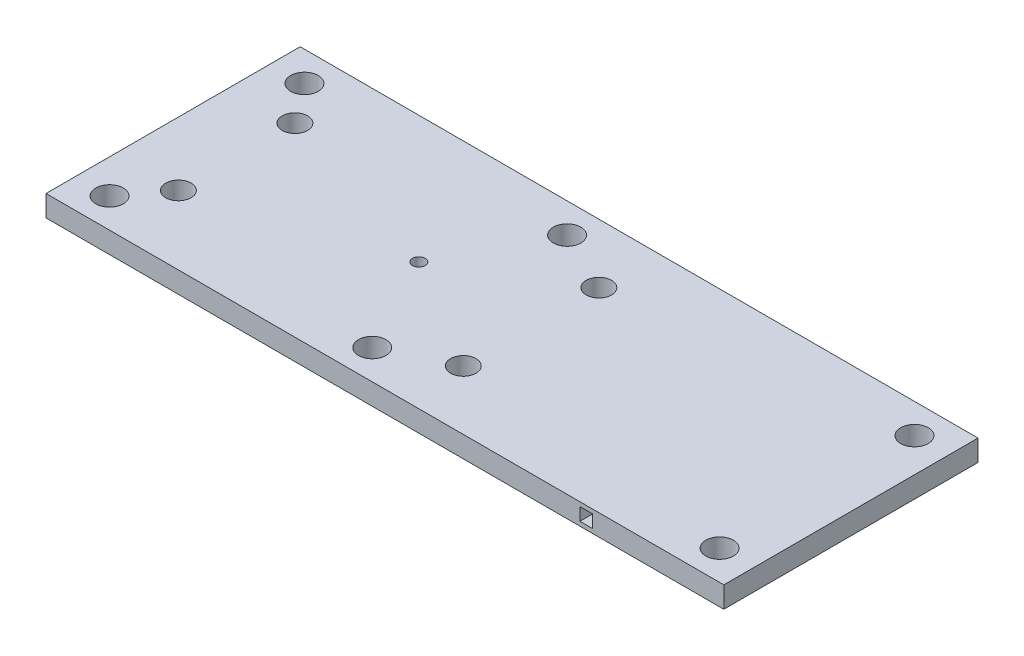
ISO-10303-21;
HEADER;
FILE_DESCRIPTION(('STEP AP214'),'2;1');
FILE_NAME('part.step','',(''),(''),'','','');
FILE_SCHEMA(('AUTOMOTIVE_DESIGN { 1 0 10303 214 1 1 1 1 }'));
ENDSEC;
DATA;
#1=APPLICATION_CONTEXT('core data for automotive mechanical design processes');
#2=APPLICATION_PROTOCOL_DEFINITION('international standard','automotive_design',2000,#1);
#3=PRODUCT_CONTEXT('',#1,'mechanical');
#4=PRODUCT('Part','Part','',(#3));
#5=PRODUCT_RELATED_PRODUCT_CATEGORY('part','',(#4));
#6=PRODUCT_DEFINITION_FORMATION('','',#4);
#7=PRODUCT_DEFINITION_CONTEXT('part definition',#1,'design');
#8=PRODUCT_DEFINITION('design','',#6,#7);
#9=PRODUCT_DEFINITION_SHAPE('','',#8);
#10=(LENGTH_UNIT() NAMED_UNIT(*) SI_UNIT(.MILLI.,.METRE.));
#11=(NAMED_UNIT(*) PLANE_ANGLE_UNIT() SI_UNIT($,.RADIAN.));
#12=(NAMED_UNIT(*) SI_UNIT($,.STERADIAN.) SOLID_ANGLE_UNIT());
#13=UNCERTAINTY_MEASURE_WITH_UNIT(LENGTH_MEASURE(1.E-05),#10,'distance_accuracy_value','');
#14=(GEOMETRIC_REPRESENTATION_CONTEXT(3) GLOBAL_UNCERTAINTY_ASSIGNED_CONTEXT((#13)) GLOBAL_UNIT_ASSIGNED_CONTEXT((#10,
#11,#12)) REPRESENTATION_CONTEXT('',''));
#15=CARTESIAN_POINT('',(0.,0.,0.));
#16=DIRECTION('',(0.,0.,1.));
#17=DIRECTION('',(1.,0.,0.));
#18=AXIS2_PLACEMENT_3D('',#15,#16,#17);
#19=CARTESIAN_POINT('',(0.,5.,0.));
#20=DIRECTION('',(0.,-1.,0.));
#21=DIRECTION('',(0.,0.,-1.));
#22=AXIS2_PLACEMENT_3D('',#19,#20,#21);
#23=PLANE('',#22);
#24=DIRECTION('',(0.,0.,-1.));
#25=VECTOR('',#24,1.);
#26=CARTESIAN_POINT('',(80.,5.,30.));
#27=LINE('',#26,#25);
#28=CARTESIAN_POINT('',(80.,5.,30.));
#29=VERTEX_POINT('',#28);
#30=CARTESIAN_POINT('',(80.,5.,-30.));
#31=VERTEX_POINT('',#30);
#32=EDGE_CURVE('E213',#29,#31,#27,.T.);
#33=ORIENTED_EDGE('',*,*,#32,.T.);
#34=DIRECTION('',(-1.,0.,0.));
#35=VECTOR('',#34,1.);
#36=CARTESIAN_POINT('',(-80.,5.,-30.));
#37=LINE('',#36,#35);
#38=CARTESIAN_POINT('',(-80.,5.,-30.));
#39=VERTEX_POINT('',#38);
#40=EDGE_CURVE('E216',#31,#39,#37,.T.);
#41=ORIENTED_EDGE('',*,*,#40,.T.);
#42=DIRECTION('',(0.,0.,1.));
#43=VECTOR('',#42,1.);
#44=CARTESIAN_POINT('',(-80.,5.,30.));
#45=LINE('',#44,#43);
#46=CARTESIAN_POINT('',(-80.,5.,30.));
#47=VERTEX_POINT('',#46);
#48=EDGE_CURVE('E219',#39,#47,#45,.T.);
#49=ORIENTED_EDGE('',*,*,#48,.T.);
#50=DIRECTION('',(1.,0.,0.));
#51=VECTOR('',#50,1.);
#52=CARTESIAN_POINT('',(-80.,5.,30.));
#53=LINE('',#52,#51);
#54=EDGE_CURVE('E221',#47,#29,#53,.T.);
#55=ORIENTED_EDGE('',*,*,#54,.T.);
#56=EDGE_LOOP('',(#33,#41,#49,#55));
#57=FACE_BOUND('',#56,.T.);
#58=CARTESIAN_POINT('',(-72.,5.,-23.));
#59=DIRECTION('',(0.,1.,0.));
#60=DIRECTION('',(0.,0.,1.));
#61=AXIS2_PLACEMENT_3D('',#58,#59,#60);
#62=CIRCLE('',#61,3.25000000000001);
#63=CARTESIAN_POINT('',(-72.,5.,-19.75));
#64=VERTEX_POINT('',#63);
#65=EDGE_CURVE('E207',#64,#64,#62,.T.);
#66=ORIENTED_EDGE('',*,*,#65,.F.);
#67=EDGE_LOOP('',(#66));
#68=FACE_BOUND('',#67,.T.);
#69=CARTESIAN_POINT('',(-72.,5.,23.));
#70=DIRECTION('',(0.,1.,0.));
#71=DIRECTION('',(0.,0.,1.));
#72=AXIS2_PLACEMENT_3D('',#69,#70,#71);
#73=CIRCLE('',#72,3.25000000000001);
#74=CARTESIAN_POINT('',(-72.,5.,26.25));
#75=VERTEX_POINT('',#74);
#76=EDGE_CURVE('E201',#75,#75,#73,.T.);
#77=ORIENTED_EDGE('',*,*,#76,.F.);
#78=EDGE_LOOP('',(#77));
#79=FACE_BOUND('',#78,.T.);
#80=CARTESIAN_POINT('',(72.,5.,-23.));
#81=DIRECTION('',(0.,1.,0.));
#82=DIRECTION('',(0.,0.,1.));
#83=AXIS2_PLACEMENT_3D('',#80,#81,#82);
#84=CIRCLE('',#83,3.25000000000001);
#85=CARTESIAN_POINT('',(72.,5.,-19.75));
#86=VERTEX_POINT('',#85);
#87=EDGE_CURVE('E195',#86,#86,#84,.T.);
#88=ORIENTED_EDGE('',*,*,#87,.F.);
#89=EDGE_LOOP('',(#88));
#90=FACE_BOUND('',#89,.T.);
#91=CARTESIAN_POINT('',(72.,5.,23.));
#92=DIRECTION('',(0.,1.,0.));
#93=DIRECTION('',(0.,0.,1.));
#94=AXIS2_PLACEMENT_3D('',#91,#92,#93);
#95=CIRCLE('',#94,3.25000000000001);
#96=CARTESIAN_POINT('',(72.,5.,26.25));
#97=VERTEX_POINT('',#96);
#98=EDGE_CURVE('E189',#97,#97,#95,.T.);
#99=ORIENTED_EDGE('',*,*,#98,.F.);
#100=EDGE_LOOP('',(#99));
#101=FACE_BOUND('',#100,.T.);
#102=CARTESIAN_POINT('',(-9.99999999999999,5.,-23.));
#103=DIRECTION('',(0.,1.,0.));
#104=DIRECTION('',(0.,0.,1.));
#105=AXIS2_PLACEMENT_3D('',#102,#103,#104);
#106=CIRCLE('',#105,3.25);
#107=CARTESIAN_POINT('',(-9.99999999999999,5.,-19.75));
#108=VERTEX_POINT('',#107);
#109=EDGE_CURVE('E183',#108,#108,#106,.T.);
#110=ORIENTED_EDGE('',*,*,#109,.F.);
#111=EDGE_LOOP('',(#110));
#112=FACE_BOUND('',#111,.T.);
#113=CARTESIAN_POINT('',(-9.99999999999999,5.,23.));
#114=DIRECTION('',(0.,1.,0.));
#115=DIRECTION('',(0.,0.,1.));
#116=AXIS2_PLACEMENT_3D('',#113,#114,#115);
#117=CIRCLE('',#116,3.25);
#118=CARTESIAN_POINT('',(-9.99999999999999,5.,26.25));
#119=VERTEX_POINT('',#118);
#120=EDGE_CURVE('E177',#119,#119,#117,.T.);
#121=ORIENTED_EDGE('',*,*,#120,.F.);
#122=EDGE_LOOP('',(#121));
#123=FACE_BOUND('',#122,.T.);
#124=CARTESIAN_POINT('',(4.5,5.,-16.));
#125=DIRECTION('',(0.,1.,0.));
#126=DIRECTION('',(0.,0.,1.));
#127=AXIS2_PLACEMENT_3D('',#124,#125,#126);
#128=CIRCLE('',#127,3.);
#129=CARTESIAN_POINT('',(4.5,5.,-13.));
#130=VERTEX_POINT('',#129);
#131=EDGE_CURVE('E171',#130,#130,#128,.T.);
#132=ORIENTED_EDGE('',*,*,#131,.F.);
#133=EDGE_LOOP('',(#132));
#134=FACE_BOUND('',#133,.T.);
#135=CARTESIAN_POINT('',(4.5,5.,16.));
#136=DIRECTION('',(0.,1.,0.));
#137=DIRECTION('',(0.,0.,1.));
#138=AXIS2_PLACEMENT_3D('',#135,#136,#137);
#139=CIRCLE('',#138,3.);
#140=CARTESIAN_POINT('',(4.5,5.,19.));
#141=VERTEX_POINT('',#140);
#142=EDGE_CURVE('E165',#141,#141,#139,.T.);
#143=ORIENTED_EDGE('',*,*,#142,.F.);
#144=EDGE_LOOP('',(#143));
#145=FACE_BOUND('',#144,.T.);
#146=CARTESIAN_POINT('',(-65.,5.,-13.75));
#147=DIRECTION('',(0.,1.,0.));
#148=DIRECTION('',(0.,0.,1.));
#149=AXIS2_PLACEMENT_3D('',#146,#147,#148);
#150=CIRCLE('',#149,3.);
#151=CARTESIAN_POINT('',(-65.,5.,-10.75));
#152=VERTEX_POINT('',#151);
#153=EDGE_CURVE('E159',#152,#152,#150,.T.);
#154=ORIENTED_EDGE('',*,*,#153,.F.);
#155=EDGE_LOOP('',(#154));
#156=FACE_BOUND('',#155,.T.);
#157=CARTESIAN_POINT('',(-65.,5.,13.75));
#158=DIRECTION('',(0.,1.,0.));
#159=DIRECTION('',(0.,0.,1.));
#160=AXIS2_PLACEMENT_3D('',#157,#158,#159);
#161=CIRCLE('',#160,3.);
#162=CARTESIAN_POINT('',(-65.,5.,16.75));
#163=VERTEX_POINT('',#162);
#164=EDGE_CURVE('E153',#163,#163,#161,.T.);
#165=ORIENTED_EDGE('',*,*,#164,.F.);
#166=EDGE_LOOP('',(#165));
#167=FACE_BOUND('',#166,.T.);
#168=CARTESIAN_POINT('',(-22.,5.,0.));
#169=DIRECTION('',(0.,1.,0.));
#170=DIRECTION('',(0.,0.,1.));
#171=AXIS2_PLACEMENT_3D('',#168,#169,#170);
#172=CIRCLE('',#171,1.5);
#173=CARTESIAN_POINT('',(-22.,5.,1.5));
#174=VERTEX_POINT('',#173);
#175=EDGE_CURVE('E147',#174,#174,#172,.T.);
#176=ORIENTED_EDGE('',*,*,#175,.F.);
#177=EDGE_LOOP('',(#176));
#178=FACE_BOUND('',#177,.T.);
#179=ADVANCED_FACE('F44',(#57,#68,#79,#90,#101,#112,#123,#134,#145,#156,#167,#178),#23,.F.);
#180=CARTESIAN_POINT('',(0.,0.,0.));
#181=DIRECTION('',(0.,-1.,0.));
#182=DIRECTION('',(0.,0.,-1.));
#183=AXIS2_PLACEMENT_3D('',#180,#181,#182);
#184=PLANE('',#183);
#185=CARTESIAN_POINT('',(-65.,0.,13.75));
#186=DIRECTION('',(0.,1.,0.));
#187=DIRECTION('',(0.,0.,1.));
#188=AXIS2_PLACEMENT_3D('',#185,#186,#187);
#189=CIRCLE('',#188,3.);
#190=CARTESIAN_POINT('',(-65.,0.,16.75));
#191=VERTEX_POINT('',#190);
#192=EDGE_CURVE('E150',#191,#191,#189,.T.);
#193=ORIENTED_EDGE('',*,*,#192,.T.);
#194=EDGE_LOOP('',(#193));
#195=FACE_BOUND('',#194,.T.);
#196=CARTESIAN_POINT('',(4.5,0.,16.));
#197=DIRECTION('',(0.,1.,0.));
#198=DIRECTION('',(0.,0.,1.));
#199=AXIS2_PLACEMENT_3D('',#196,#197,#198);
#200=CIRCLE('',#199,3.);
#201=CARTESIAN_POINT('',(4.5,0.,19.));
#202=VERTEX_POINT('',#201);
#203=EDGE_CURVE('E162',#202,#202,#200,.T.);
#204=ORIENTED_EDGE('',*,*,#203,.T.);
#205=EDGE_LOOP('',(#204));
#206=FACE_BOUND('',#205,.T.);
#207=CARTESIAN_POINT('',(-9.99999999999999,0.,23.));
#208=DIRECTION('',(0.,1.,0.));
#209=DIRECTION('',(0.,0.,1.));
#210=AXIS2_PLACEMENT_3D('',#207,#208,#209);
#211=CIRCLE('',#210,3.25);
#212=CARTESIAN_POINT('',(-9.99999999999999,0.,26.25));
#213=VERTEX_POINT('',#212);
#214=EDGE_CURVE('E174',#213,#213,#211,.T.);
#215=ORIENTED_EDGE('',*,*,#214,.T.);
#216=EDGE_LOOP('',(#215));
#217=FACE_BOUND('',#216,.T.);
#218=CARTESIAN_POINT('',(72.,0.,23.));
#219=DIRECTION('',(0.,1.,0.));
#220=DIRECTION('',(0.,0.,1.));
#221=AXIS2_PLACEMENT_3D('',#218,#219,#220);
#222=CIRCLE('',#221,3.25000000000001);
#223=CARTESIAN_POINT('',(72.,0.,26.25));
#224=VERTEX_POINT('',#223);
#225=EDGE_CURVE('E186',#224,#224,#222,.T.);
#226=ORIENTED_EDGE('',*,*,#225,.T.);
#227=EDGE_LOOP('',(#226));
#228=FACE_BOUND('',#227,.T.);
#229=CARTESIAN_POINT('',(-72.,0.,23.));
#230=DIRECTION('',(0.,1.,0.));
#231=DIRECTION('',(0.,0.,1.));
#232=AXIS2_PLACEMENT_3D('',#229,#230,#231);
#233=CIRCLE('',#232,3.25000000000001);
#234=CARTESIAN_POINT('',(-72.,0.,26.25));
#235=VERTEX_POINT('',#234);
#236=EDGE_CURVE('E198',#235,#235,#233,.T.);
#237=ORIENTED_EDGE('',*,*,#236,.T.);
#238=EDGE_LOOP('',(#237));
#239=FACE_BOUND('',#238,.T.);
#240=DIRECTION('',(0.,0.,-1.));
#241=VECTOR('',#240,1.);
#242=CARTESIAN_POINT('',(80.,0.,30.));
#243=LINE('',#242,#241);
#244=CARTESIAN_POINT('',(80.,0.,30.));
#245=VERTEX_POINT('',#244);
#246=CARTESIAN_POINT('',(80.,0.,-30.));
#247=VERTEX_POINT('',#246);
#248=EDGE_CURVE('E210',#245,#247,#243,.T.);
#249=ORIENTED_EDGE('',*,*,#248,.F.);
#250=DIRECTION('',(1.,0.,0.));
#251=VECTOR('',#250,1.);
#252=CARTESIAN_POINT('',(-80.,0.,30.));
#253=LINE('',#252,#251);
#254=CARTESIAN_POINT('',(-80.,0.,30.));
#255=VERTEX_POINT('',#254);
#256=EDGE_CURVE('E217',#255,#245,#253,.T.);
#257=ORIENTED_EDGE('',*,*,#256,.F.);
#258=DIRECTION('',(0.,0.,1.));
#259=VECTOR('',#258,1.);
#260=CARTESIAN_POINT('',(-80.,0.,30.));
#261=LINE('',#260,#259);
#262=CARTESIAN_POINT('',(-80.,0.,-30.));
#263=VERTEX_POINT('',#262);
#264=EDGE_CURVE('E228',#263,#255,#261,.T.);
#265=ORIENTED_EDGE('',*,*,#264,.F.);
#266=DIRECTION('',(-1.,0.,0.));
#267=VECTOR('',#266,1.);
#268=CARTESIAN_POINT('',(-80.,0.,-30.));
#269=LINE('',#268,#267);
#270=EDGE_CURVE('E226',#247,#263,#269,.T.);
#271=ORIENTED_EDGE('',*,*,#270,.F.);
#272=EDGE_LOOP('',(#249,#257,#265,#271));
#273=FACE_BOUND('',#272,.T.);
#274=CARTESIAN_POINT('',(-72.,0.,-23.));
#275=DIRECTION('',(0.,1.,0.));
#276=DIRECTION('',(0.,0.,1.));
#277=AXIS2_PLACEMENT_3D('',#274,#275,#276);
#278=CIRCLE('',#277,3.25000000000001);
#279=CARTESIAN_POINT('',(-72.,0.,-19.75));
#280=VERTEX_POINT('',#279);
#281=EDGE_CURVE('E204',#280,#280,#278,.T.);
#282=ORIENTED_EDGE('',*,*,#281,.T.);
#283=EDGE_LOOP('',(#282));
#284=FACE_BOUND('',#283,.T.);
#285=CARTESIAN_POINT('',(72.,0.,-23.));
#286=DIRECTION('',(0.,1.,0.));
#287=DIRECTION('',(0.,0.,1.));
#288=AXIS2_PLACEMENT_3D('',#285,#286,#287);
#289=CIRCLE('',#288,3.25000000000001);
#290=CARTESIAN_POINT('',(72.,0.,-19.75));
#291=VERTEX_POINT('',#290);
#292=EDGE_CURVE('E192',#291,#291,#289,.T.);
#293=ORIENTED_EDGE('',*,*,#292,.T.);
#294=EDGE_LOOP('',(#293));
#295=FACE_BOUND('',#294,.T.);
#296=CARTESIAN_POINT('',(-9.99999999999999,0.,-23.));
#297=DIRECTION('',(0.,1.,0.));
#298=DIRECTION('',(0.,0.,1.));
#299=AXIS2_PLACEMENT_3D('',#296,#297,#298);
#300=CIRCLE('',#299,3.25);
#301=CARTESIAN_POINT('',(-9.99999999999999,0.,-19.75));
#302=VERTEX_POINT('',#301);
#303=EDGE_CURVE('E180',#302,#302,#300,.T.);
#304=ORIENTED_EDGE('',*,*,#303,.T.);
#305=EDGE_LOOP('',(#304));
#306=FACE_BOUND('',#305,.T.);
#307=CARTESIAN_POINT('',(4.5,0.,-16.));
#308=DIRECTION('',(0.,1.,0.));
#309=DIRECTION('',(0.,0.,1.));
#310=AXIS2_PLACEMENT_3D('',#307,#308,#309);
#311=CIRCLE('',#310,3.);
#312=CARTESIAN_POINT('',(4.5,0.,-13.));
#313=VERTEX_POINT('',#312);
#314=EDGE_CURVE('E168',#313,#313,#311,.T.);
#315=ORIENTED_EDGE('',*,*,#314,.T.);
#316=EDGE_LOOP('',(#315));
#317=FACE_BOUND('',#316,.T.);
#318=CARTESIAN_POINT('',(-65.,0.,-13.75));
#319=DIRECTION('',(0.,1.,0.));
#320=DIRECTION('',(0.,0.,1.));
#321=AXIS2_PLACEMENT_3D('',#318,#319,#320);
#322=CIRCLE('',#321,3.);
#323=CARTESIAN_POINT('',(-65.,0.,-10.75));
#324=VERTEX_POINT('',#323);
#325=EDGE_CURVE('E156',#324,#324,#322,.T.);
#326=ORIENTED_EDGE('',*,*,#325,.T.);
#327=EDGE_LOOP('',(#326));
#328=FACE_BOUND('',#327,.T.);
#329=CARTESIAN_POINT('',(-22.,0.,0.));
#330=DIRECTION('',(0.,1.,0.));
#331=DIRECTION('',(0.,0.,1.));
#332=AXIS2_PLACEMENT_3D('',#329,#330,#331);
#333=CIRCLE('',#332,1.5);
#334=CARTESIAN_POINT('',(-22.,0.,1.5));
#335=VERTEX_POINT('',#334);
#336=EDGE_CURVE('E146',#335,#335,#333,.T.);
#337=ORIENTED_EDGE('',*,*,#336,.T.);
#338=EDGE_LOOP('',(#337));
#339=FACE_BOUND('',#338,.T.);
#340=ADVANCED_FACE('F246',(#195,#206,#217,#228,#239,#273,#284,#295,#306,#317,#328,#339),#184,.T.);
#341=CARTESIAN_POINT('',(80.,5.,30.));
#342=DIRECTION('',(-1.,0.,0.));
#343=DIRECTION('',(0.,0.,1.));
#344=AXIS2_PLACEMENT_3D('',#341,#342,#343);
#345=PLANE('',#344);
#346=ORIENTED_EDGE('',*,*,#248,.T.);
#347=DIRECTION('',(0.,-1.,0.));
#348=VECTOR('',#347,1.);
#349=CARTESIAN_POINT('',(80.,5.,-30.));
#350=LINE('',#349,#348);
#351=EDGE_CURVE('E11',#31,#247,#350,.T.);
#352=ORIENTED_EDGE('',*,*,#351,.F.);
#353=ORIENTED_EDGE('',*,*,#32,.F.);
#354=DIRECTION('',(0.,-1.,0.));
#355=VECTOR('',#354,1.);
#356=CARTESIAN_POINT('',(80.,5.,30.));
#357=LINE('',#356,#355);
#358=EDGE_CURVE('E223',#29,#245,#357,.T.);
#359=ORIENTED_EDGE('',*,*,#358,.T.);
#360=EDGE_LOOP('',(#346,#352,#353,#359));
#361=FACE_BOUND('',#360,.T.);
#362=ADVANCED_FACE('F46',(#361),#345,.F.);
#363=CARTESIAN_POINT('',(-80.,5.,-30.));
#364=DIRECTION('',(0.,0.,1.));
#365=DIRECTION('',(1.,0.,0.));
#366=AXIS2_PLACEMENT_3D('',#363,#364,#365);
#367=PLANE('',#366);
#368=DIRECTION('',(1.,0.,0.));
#369=VECTOR('',#368,1.);
#370=CARTESIAN_POINT('',(-80.,0.999999999999997,-30.));
#371=LINE('',#370,#369);
#372=CARTESIAN_POINT('',(46.0306071273797,0.999999999999997,-30.));
#373=VERTEX_POINT('',#372);
#374=CARTESIAN_POINT('',(49.0306071273797,0.999999999999997,-30.));
#375=VERTEX_POINT('',#374);
#376=EDGE_CURVE('E140',#373,#375,#371,.T.);
#377=ORIENTED_EDGE('',*,*,#376,.T.);
#378=DIRECTION('',(0.,1.,0.));
#379=VECTOR('',#378,1.);
#380=CARTESIAN_POINT('',(49.0306071273797,5.,-30.));
#381=LINE('',#380,#379);
#382=CARTESIAN_POINT('',(49.0306071273797,4.,-30.));
#383=VERTEX_POINT('',#382);
#384=EDGE_CURVE('E143',#375,#383,#381,.T.);
#385=ORIENTED_EDGE('',*,*,#384,.T.);
#386=DIRECTION('',(-1.,0.,0.));
#387=VECTOR('',#386,1.);
#388=CARTESIAN_POINT('',(-80.,4.,-30.));
#389=LINE('',#388,#387);
#390=CARTESIAN_POINT('',(46.0306071273797,4.,-30.));
#391=VERTEX_POINT('',#390);
#392=EDGE_CURVE('E135',#383,#391,#389,.T.);
#393=ORIENTED_EDGE('',*,*,#392,.T.);
#394=DIRECTION('',(0.,-1.,0.));
#395=VECTOR('',#394,1.);
#396=CARTESIAN_POINT('',(46.0306071273797,5.,-30.));
#397=LINE('',#396,#395);
#398=EDGE_CURVE('E115',#391,#373,#397,.T.);
#399=ORIENTED_EDGE('',*,*,#398,.T.);
#400=EDGE_LOOP('',(#377,#385,#393,#399));
#401=FACE_BOUND('',#400,.T.);
#402=ORIENTED_EDGE('',*,*,#270,.T.);
#403=DIRECTION('',(0.,-1.,0.));
#404=VECTOR('',#403,1.);
#405=CARTESIAN_POINT('',(-80.,5.,-30.));
#406=LINE('',#405,#404);
#407=EDGE_CURVE('E52',#39,#263,#406,.T.);
#408=ORIENTED_EDGE('',*,*,#407,.F.);
#409=ORIENTED_EDGE('',*,*,#40,.F.);
#410=ORIENTED_EDGE('',*,*,#351,.T.);
#411=EDGE_LOOP('',(#402,#408,#409,#410));
#412=FACE_BOUND('',#411,.T.);
#413=ADVANCED_FACE('F255',(#401,#412),#367,.F.);
#414=CARTESIAN_POINT('',(-80.,5.,30.));
#415=DIRECTION('',(1.,0.,0.));
#416=DIRECTION('',(0.,0.,-1.));
#417=AXIS2_PLACEMENT_3D('',#414,#415,#416);
#418=PLANE('',#417);
#419=ORIENTED_EDGE('',*,*,#264,.T.);
#420=DIRECTION('',(0.,-1.,0.));
#421=VECTOR('',#420,1.);
#422=CARTESIAN_POINT('',(-80.,5.,30.));
#423=LINE('',#422,#421);
#424=EDGE_CURVE('E233',#47,#255,#423,.T.);
#425=ORIENTED_EDGE('',*,*,#424,.F.);
#426=ORIENTED_EDGE('',*,*,#48,.F.);
#427=ORIENTED_EDGE('',*,*,#407,.T.);
#428=EDGE_LOOP('',(#419,#425,#426,#427));
#429=FACE_BOUND('',#428,.T.);
#430=ADVANCED_FACE('F240',(#429),#418,.F.);
#431=CARTESIAN_POINT('',(-80.,5.,30.));
#432=DIRECTION('',(0.,0.,-1.));
#433=DIRECTION('',(-1.,0.,0.));
#434=AXIS2_PLACEMENT_3D('',#431,#432,#433);
#435=PLANE('',#434);
#436=DIRECTION('',(-1.,0.,0.));
#437=VECTOR('',#436,1.);
#438=CARTESIAN_POINT('',(46.0306071273797,4.,30.));
#439=LINE('',#438,#437);
#440=CARTESIAN_POINT('',(49.0306071273797,4.,30.));
#441=VERTEX_POINT('',#440);
#442=CARTESIAN_POINT('',(46.0306071273797,4.,30.));
#443=VERTEX_POINT('',#442);
#444=EDGE_CURVE('E121',#441,#443,#439,.T.);
#445=ORIENTED_EDGE('',*,*,#444,.F.);
#446=DIRECTION('',(0.,1.,0.));
#447=VECTOR('',#446,1.);
#448=CARTESIAN_POINT('',(49.0306071273797,4.,30.));
#449=LINE('',#448,#447);
#450=CARTESIAN_POINT('',(49.0306071273797,0.999999999999997,30.));
#451=VERTEX_POINT('',#450);
#452=EDGE_CURVE('E67',#451,#441,#449,.T.);
#453=ORIENTED_EDGE('',*,*,#452,.F.);
#454=DIRECTION('',(1.,0.,0.));
#455=VECTOR('',#454,1.);
#456=CARTESIAN_POINT('',(46.0306071273797,0.999999999999997,30.));
#457=LINE('',#456,#455);
#458=CARTESIAN_POINT('',(46.0306071273797,0.999999999999997,30.));
#459=VERTEX_POINT('',#458);
#460=EDGE_CURVE('E128',#459,#451,#457,.T.);
#461=ORIENTED_EDGE('',*,*,#460,.F.);
#462=DIRECTION('',(0.,-1.,0.));
#463=VECTOR('',#462,1.);
#464=CARTESIAN_POINT('',(46.0306071273797,4.,30.));
#465=LINE('',#464,#463);
#466=EDGE_CURVE('E112',#443,#459,#465,.T.);
#467=ORIENTED_EDGE('',*,*,#466,.F.);
#468=EDGE_LOOP('',(#445,#453,#461,#467));
#469=FACE_BOUND('',#468,.T.);
#470=ORIENTED_EDGE('',*,*,#256,.T.);
#471=ORIENTED_EDGE('',*,*,#358,.F.);
#472=ORIENTED_EDGE('',*,*,#54,.F.);
#473=ORIENTED_EDGE('',*,*,#424,.T.);
#474=EDGE_LOOP('',(#470,#471,#472,#473));
#475=FACE_BOUND('',#474,.T.);
#476=ADVANCED_FACE('F125',(#469,#475),#435,.F.);
#477=CARTESIAN_POINT('',(-72.,5.,-23.));
#478=DIRECTION('',(0.,-1.,0.));
#479=DIRECTION('',(0.,0.,-1.));
#480=AXIS2_PLACEMENT_3D('',#477,#478,#479);
#481=CYLINDRICAL_SURFACE('',#480,3.25000000000001);
#482=ORIENTED_EDGE('',*,*,#65,.T.);
#483=EDGE_LOOP('',(#482));
#484=FACE_BOUND('',#483,.T.);
#485=ORIENTED_EDGE('',*,*,#281,.F.);
#486=EDGE_LOOP('',(#485));
#487=FACE_BOUND('',#486,.T.);
#488=ADVANCED_FACE('F271',(#484,#487),#481,.F.);
#489=CARTESIAN_POINT('',(-72.,5.,23.));
#490=DIRECTION('',(0.,-1.,0.));
#491=DIRECTION('',(0.,0.,-1.));
#492=AXIS2_PLACEMENT_3D('',#489,#490,#491);
#493=CYLINDRICAL_SURFACE('',#492,3.25000000000001);
#494=ORIENTED_EDGE('',*,*,#76,.T.);
#495=EDGE_LOOP('',(#494));
#496=FACE_BOUND('',#495,.T.);
#497=ORIENTED_EDGE('',*,*,#236,.F.);
#498=EDGE_LOOP('',(#497));
#499=FACE_BOUND('',#498,.T.);
#500=ADVANCED_FACE('F278',(#496,#499),#493,.F.);
#501=CARTESIAN_POINT('',(72.,5.,-23.));
#502=DIRECTION('',(0.,-1.,0.));
#503=DIRECTION('',(0.,0.,-1.));
#504=AXIS2_PLACEMENT_3D('',#501,#502,#503);
#505=CYLINDRICAL_SURFACE('',#504,3.25000000000001);
#506=ORIENTED_EDGE('',*,*,#87,.T.);
#507=EDGE_LOOP('',(#506));
#508=FACE_BOUND('',#507,.T.);
#509=ORIENTED_EDGE('',*,*,#292,.F.);
#510=EDGE_LOOP('',(#509));
#511=FACE_BOUND('',#510,.T.);
#512=ADVANCED_FACE('F283',(#508,#511),#505,.F.);
#513=CARTESIAN_POINT('',(72.,5.,23.));
#514=DIRECTION('',(0.,-1.,0.));
#515=DIRECTION('',(0.,0.,-1.));
#516=AXIS2_PLACEMENT_3D('',#513,#514,#515);
#517=CYLINDRICAL_SURFACE('',#516,3.25000000000001);
#518=ORIENTED_EDGE('',*,*,#98,.T.);
#519=EDGE_LOOP('',(#518));
#520=FACE_BOUND('',#519,.T.);
#521=ORIENTED_EDGE('',*,*,#225,.F.);
#522=EDGE_LOOP('',(#521));
#523=FACE_BOUND('',#522,.T.);
#524=ADVANCED_FACE('F334',(#520,#523),#517,.F.);
#525=CARTESIAN_POINT('',(-9.99999999999999,5.,-23.));
#526=DIRECTION('',(0.,-1.,0.));
#527=DIRECTION('',(0.,0.,-1.));
#528=AXIS2_PLACEMENT_3D('',#525,#526,#527);
#529=CYLINDRICAL_SURFACE('',#528,3.25);
#530=ORIENTED_EDGE('',*,*,#109,.T.);
#531=EDGE_LOOP('',(#530));
#532=FACE_BOUND('',#531,.T.);
#533=ORIENTED_EDGE('',*,*,#303,.F.);
#534=EDGE_LOOP('',(#533));
#535=FACE_BOUND('',#534,.T.);
#536=ADVANCED_FACE('F330',(#532,#535),#529,.F.);
#537=CARTESIAN_POINT('',(-9.99999999999999,5.,23.));
#538=DIRECTION('',(0.,-1.,0.));
#539=DIRECTION('',(0.,0.,-1.));
#540=AXIS2_PLACEMENT_3D('',#537,#538,#539);
#541=CYLINDRICAL_SURFACE('',#540,3.25);
#542=ORIENTED_EDGE('',*,*,#120,.T.);
#543=EDGE_LOOP('',(#542));
#544=FACE_BOUND('',#543,.T.);
#545=ORIENTED_EDGE('',*,*,#214,.F.);
#546=EDGE_LOOP('',(#545));
#547=FACE_BOUND('',#546,.T.);
#548=ADVANCED_FACE('F326',(#544,#547),#541,.F.);
#549=CARTESIAN_POINT('',(4.5,5.,-16.));
#550=DIRECTION('',(0.,-1.,0.));
#551=DIRECTION('',(0.,0.,-1.));
#552=AXIS2_PLACEMENT_3D('',#549,#550,#551);
#553=CYLINDRICAL_SURFACE('',#552,3.);
#554=ORIENTED_EDGE('',*,*,#131,.T.);
#555=EDGE_LOOP('',(#554));
#556=FACE_BOUND('',#555,.T.);
#557=ORIENTED_EDGE('',*,*,#314,.F.);
#558=EDGE_LOOP('',(#557));
#559=FACE_BOUND('',#558,.T.);
#560=ADVANCED_FACE('F322',(#556,#559),#553,.F.);
#561=CARTESIAN_POINT('',(4.5,5.,16.));
#562=DIRECTION('',(0.,-1.,0.));
#563=DIRECTION('',(0.,0.,-1.));
#564=AXIS2_PLACEMENT_3D('',#561,#562,#563);
#565=CYLINDRICAL_SURFACE('',#564,3.);
#566=ORIENTED_EDGE('',*,*,#142,.T.);
#567=EDGE_LOOP('',(#566));
#568=FACE_BOUND('',#567,.T.);
#569=ORIENTED_EDGE('',*,*,#203,.F.);
#570=EDGE_LOOP('',(#569));
#571=FACE_BOUND('',#570,.T.);
#572=ADVANCED_FACE('F318',(#568,#571),#565,.F.);
#573=CARTESIAN_POINT('',(-65.,5.,-13.75));
#574=DIRECTION('',(0.,-1.,0.));
#575=DIRECTION('',(0.,0.,-1.));
#576=AXIS2_PLACEMENT_3D('',#573,#574,#575);
#577=CYLINDRICAL_SURFACE('',#576,3.);
#578=ORIENTED_EDGE('',*,*,#153,.T.);
#579=EDGE_LOOP('',(#578));
#580=FACE_BOUND('',#579,.T.);
#581=ORIENTED_EDGE('',*,*,#325,.F.);
#582=EDGE_LOOP('',(#581));
#583=FACE_BOUND('',#582,.T.);
#584=ADVANCED_FACE('F311',(#580,#583),#577,.F.);
#585=CARTESIAN_POINT('',(-65.,5.,13.75));
#586=DIRECTION('',(0.,-1.,0.));
#587=DIRECTION('',(0.,0.,-1.));
#588=AXIS2_PLACEMENT_3D('',#585,#586,#587);
#589=CYLINDRICAL_SURFACE('',#588,3.);
#590=ORIENTED_EDGE('',*,*,#164,.T.);
#591=EDGE_LOOP('',(#590));
#592=FACE_BOUND('',#591,.T.);
#593=ORIENTED_EDGE('',*,*,#192,.F.);
#594=EDGE_LOOP('',(#593));
#595=FACE_BOUND('',#594,.T.);
#596=ADVANCED_FACE('F302',(#592,#595),#589,.F.);
#597=CARTESIAN_POINT('',(-22.,5.,0.));
#598=DIRECTION('',(0.,-1.,0.));
#599=DIRECTION('',(0.,0.,-1.));
#600=AXIS2_PLACEMENT_3D('',#597,#598,#599);
#601=CYLINDRICAL_SURFACE('',#600,1.5);
#602=ORIENTED_EDGE('',*,*,#175,.T.);
#603=EDGE_LOOP('',(#602));
#604=FACE_BOUND('',#603,.T.);
#605=ORIENTED_EDGE('',*,*,#336,.F.);
#606=EDGE_LOOP('',(#605));
#607=FACE_BOUND('',#606,.T.);
#608=ADVANCED_FACE('F299',(#604,#607),#601,.F.);
#609=CARTESIAN_POINT('',(49.0306071273797,4.,-35.));
#610=DIRECTION('',(1.,0.,0.));
#611=DIRECTION('',(0.,0.,-1.));
#612=AXIS2_PLACEMENT_3D('',#609,#610,#611);
#613=PLANE('',#612);
#614=DIRECTION('',(0.,0.,1.));
#615=VECTOR('',#614,1.);
#616=CARTESIAN_POINT('',(49.0306071273797,0.999999999999997,-35.));
#617=LINE('',#616,#615);
#618=EDGE_CURVE('E133',#375,#451,#617,.T.);
#619=ORIENTED_EDGE('',*,*,#618,.T.);
#620=ORIENTED_EDGE('',*,*,#452,.T.);
#621=DIRECTION('',(0.,0.,1.));
#622=VECTOR('',#621,1.);
#623=CARTESIAN_POINT('',(49.0306071273797,4.,-35.));
#624=LINE('',#623,#622);
#625=EDGE_CURVE('E118',#383,#441,#624,.T.);
#626=ORIENTED_EDGE('',*,*,#625,.F.);
#627=ORIENTED_EDGE('',*,*,#384,.F.);
#628=EDGE_LOOP('',(#619,#620,#626,#627));
#629=FACE_BOUND('',#628,.T.);
#630=ADVANCED_FACE('F301',(#629),#613,.F.);
#631=CARTESIAN_POINT('',(46.0306071273797,0.999999999999997,-35.));
#632=DIRECTION('',(0.,-1.,0.));
#633=DIRECTION('',(0.,0.,-1.));
#634=AXIS2_PLACEMENT_3D('',#631,#632,#633);
#635=PLANE('',#634);
#636=DIRECTION('',(0.,0.,1.));
#637=VECTOR('',#636,1.);
#638=CARTESIAN_POINT('',(46.0306071273797,0.999999999999997,-35.));
#639=LINE('',#638,#637);
#640=EDGE_CURVE('E117',#373,#459,#639,.T.);
#641=ORIENTED_EDGE('',*,*,#640,.T.);
#642=ORIENTED_EDGE('',*,*,#460,.T.);
#643=ORIENTED_EDGE('',*,*,#618,.F.);
#644=ORIENTED_EDGE('',*,*,#376,.F.);
#645=EDGE_LOOP('',(#641,#642,#643,#644));
#646=FACE_BOUND('',#645,.T.);
#647=ADVANCED_FACE('F309',(#646),#635,.F.);
#648=CARTESIAN_POINT('',(46.0306071273797,4.,-35.));
#649=DIRECTION('',(-1.,0.,0.));
#650=DIRECTION('',(0.,0.,1.));
#651=AXIS2_PLACEMENT_3D('',#648,#649,#650);
#652=PLANE('',#651);
#653=DIRECTION('',(0.,0.,1.));
#654=VECTOR('',#653,1.);
#655=CARTESIAN_POINT('',(46.0306071273797,4.,-35.));
#656=LINE('',#655,#654);
#657=EDGE_CURVE('E59',#391,#443,#656,.T.);
#658=ORIENTED_EDGE('',*,*,#657,.T.);
#659=ORIENTED_EDGE('',*,*,#466,.T.);
#660=ORIENTED_EDGE('',*,*,#640,.F.);
#661=ORIENTED_EDGE('',*,*,#398,.F.);
#662=EDGE_LOOP('',(#658,#659,#660,#661));
#663=FACE_BOUND('',#662,.T.);
#664=ADVANCED_FACE('F109',(#663),#652,.F.);
#665=CARTESIAN_POINT('',(46.0306071273797,4.,-35.));
#666=DIRECTION('',(0.,1.,0.));
#667=DIRECTION('',(0.,0.,1.));
#668=AXIS2_PLACEMENT_3D('',#665,#666,#667);
#669=PLANE('',#668);
#670=ORIENTED_EDGE('',*,*,#625,.T.);
#671=ORIENTED_EDGE('',*,*,#444,.T.);
#672=ORIENTED_EDGE('',*,*,#657,.F.);
#673=ORIENTED_EDGE('',*,*,#392,.F.);
#674=EDGE_LOOP('',(#670,#671,#672,#673));
#675=FACE_BOUND('',#674,.T.);
#676=ADVANCED_FACE('F122',(#675),#669,.F.);
#677=CLOSED_SHELL('',(#179,#340,#362,#413,#430,#476,#488,#500,#512,#524,#536,#548,#560,#572,
#584,#596,#608,#630,#647,#664,#676));
#678=MANIFOLD_SOLID_BREP('B2',#677);
#679=ADVANCED_BREP_SHAPE_REPRESENTATION('',(#18,#678),#14);
#680=SHAPE_DEFINITION_REPRESENTATION(#9,#679);
ENDSEC;
END-ISO-10303-21;
